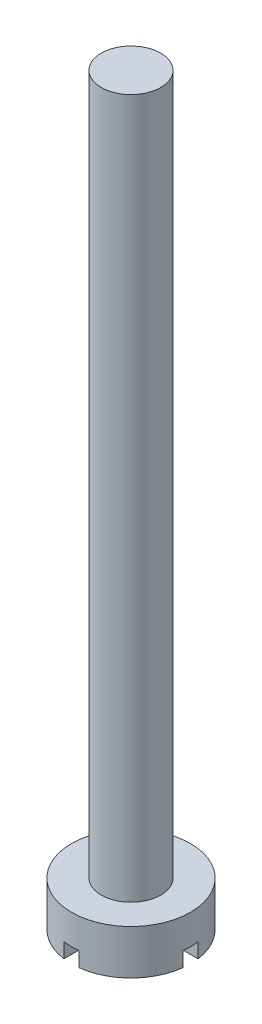
ISO-10303-21;
HEADER;
FILE_DESCRIPTION(('STEP AP214'),'2;1');
FILE_NAME('part.step','',(''),(''),'','','');
FILE_SCHEMA(('AUTOMOTIVE_DESIGN { 1 0 10303 214 1 1 1 1 }'));
ENDSEC;
DATA;
#1=APPLICATION_CONTEXT('core data for automotive mechanical design processes');
#2=APPLICATION_PROTOCOL_DEFINITION('international standard','automotive_design',2000,#1);
#3=PRODUCT_CONTEXT('',#1,'mechanical');
#4=PRODUCT('Part','Part','',(#3));
#5=PRODUCT_RELATED_PRODUCT_CATEGORY('part','',(#4));
#6=PRODUCT_DEFINITION_FORMATION('','',#4);
#7=PRODUCT_DEFINITION_CONTEXT('part definition',#1,'design');
#8=PRODUCT_DEFINITION('design','',#6,#7);
#9=PRODUCT_DEFINITION_SHAPE('','',#8);
#10=(LENGTH_UNIT() NAMED_UNIT(*) SI_UNIT(.MILLI.,.METRE.));
#11=(NAMED_UNIT(*) PLANE_ANGLE_UNIT() SI_UNIT($,.RADIAN.));
#12=(NAMED_UNIT(*) SI_UNIT($,.STERADIAN.) SOLID_ANGLE_UNIT());
#13=UNCERTAINTY_MEASURE_WITH_UNIT(LENGTH_MEASURE(1.E-05),#10,'distance_accuracy_value','');
#14=(GEOMETRIC_REPRESENTATION_CONTEXT(3) GLOBAL_UNCERTAINTY_ASSIGNED_CONTEXT((#13)) GLOBAL_UNIT_ASSIGNED_CONTEXT((#10,
#11,#12)) REPRESENTATION_CONTEXT('',''));
#15=CARTESIAN_POINT('',(0.,0.,0.));
#16=DIRECTION('',(0.,0.,1.));
#17=DIRECTION('',(1.,0.,0.));
#18=AXIS2_PLACEMENT_3D('',#15,#16,#17);
#19=CARTESIAN_POINT('',(0.,0.,0.));
#20=DIRECTION('',(0.,1.,0.));
#21=DIRECTION('',(0.,0.,1.));
#22=AXIS2_PLACEMENT_3D('',#19,#20,#21);
#23=PLANE('',#22);
#24=DIRECTION('',(0.,0.,1.));
#25=VECTOR('',#24,1.);
#26=CARTESIAN_POINT('',(-0.548123781601143,0.,0.));
#27=LINE('',#26,#25);
#28=CARTESIAN_POINT('',(-0.548123781601143,0.,-3.96226706823799));
#29=VERTEX_POINT('',#28);
#30=CARTESIAN_POINT('',(-0.548123781601143,0.,-0.542853360624412));
#31=VERTEX_POINT('',#30);
#32=EDGE_CURVE('E169',#29,#31,#27,.T.);
#33=ORIENTED_EDGE('',*,*,#32,.T.);
#34=DIRECTION('',(-1.,0.,0.));
#35=VECTOR('',#34,1.);
#36=CARTESIAN_POINT('',(0.,0.,-0.542853360624412));
#37=LINE('',#36,#35);
#38=CARTESIAN_POINT('',(-3.96299258501183,0.,-0.542853360624412));
#39=VERTEX_POINT('',#38);
#40=EDGE_CURVE('E204',#31,#39,#37,.T.);
#41=ORIENTED_EDGE('',*,*,#40,.T.);
#42=CARTESIAN_POINT('',(0.,0.,0.));
#43=DIRECTION('',(0.,1.,0.));
#44=DIRECTION('',(0.,0.,1.));
#45=AXIS2_PLACEMENT_3D('',#42,#43,#44);
#46=CIRCLE('',#45,4.);
#47=EDGE_CURVE('E262',#29,#39,#46,.T.);
#48=ORIENTED_EDGE('',*,*,#47,.F.);
#49=EDGE_LOOP('',(#33,#41,#48));
#50=FACE_BOUND('',#49,.T.);
#51=ADVANCED_FACE('F72',(#50),#23,.F.);
#52=DIRECTION('',(-1.,0.,0.));
#53=VECTOR('',#52,1.);
#54=CARTESIAN_POINT('',(0.,0.,-0.542853360624412));
#55=LINE('',#54,#53);
#56=CARTESIAN_POINT('',(3.96299258501183,0.,-0.542853360624412));
#57=VERTEX_POINT('',#56);
#58=CARTESIAN_POINT('',(0.463797045970191,0.,-0.542853360624412));
#59=VERTEX_POINT('',#58);
#60=EDGE_CURVE('E197',#57,#59,#55,.T.);
#61=ORIENTED_EDGE('',*,*,#60,.T.);
#62=DIRECTION('',(0.,0.,1.));
#63=VECTOR('',#62,1.);
#64=CARTESIAN_POINT('',(0.463797045970191,0.,0.));
#65=LINE('',#64,#63);
#66=CARTESIAN_POINT('',(0.463797045970191,0.,-3.97302055118638));
#67=VERTEX_POINT('',#66);
#68=EDGE_CURVE('E174',#67,#59,#65,.T.);
#69=ORIENTED_EDGE('',*,*,#68,.F.);
#70=EDGE_CURVE('E246',#57,#67,#46,.T.);
#71=ORIENTED_EDGE('',*,*,#70,.F.);
#72=EDGE_LOOP('',(#61,#69,#71));
#73=FACE_BOUND('',#72,.T.);
#74=ADVANCED_FACE('F285',(#73),#23,.F.);
#75=CARTESIAN_POINT('',(-3.97240175604783,0.,0.46906746694701));
#76=VERTEX_POINT('',#75);
#77=CARTESIAN_POINT('',(-0.548123781601143,0.,3.96226706823799));
#78=VERTEX_POINT('',#77);
#79=EDGE_CURVE('E238',#76,#78,#46,.T.);
#80=ORIENTED_EDGE('',*,*,#79,.F.);
#81=DIRECTION('',(-1.,0.,0.));
#82=VECTOR('',#81,1.);
#83=CARTESIAN_POINT('',(0.,0.,0.46906746694701));
#84=LINE('',#83,#82);
#85=CARTESIAN_POINT('',(-0.548123781601143,0.,0.46906746694701));
#86=VERTEX_POINT('',#85);
#87=EDGE_CURVE('E200',#86,#76,#84,.T.);
#88=ORIENTED_EDGE('',*,*,#87,.F.);
#89=DIRECTION('',(0.,0.,1.));
#90=VECTOR('',#89,1.);
#91=CARTESIAN_POINT('',(-0.548123781601143,0.,-4.18998467666297));
#92=LINE('',#91,#90);
#93=EDGE_CURVE('E225',#86,#78,#92,.T.);
#94=ORIENTED_EDGE('',*,*,#93,.T.);
#95=EDGE_LOOP('',(#80,#88,#94));
#96=FACE_BOUND('',#95,.T.);
#97=ADVANCED_FACE('F272',(#96),#23,.F.);
#98=CARTESIAN_POINT('',(0.,3.,0.));
#99=DIRECTION('',(0.,-1.,0.));
#100=DIRECTION('',(0.,0.,-1.));
#101=AXIS2_PLACEMENT_3D('',#98,#99,#100);
#102=CYLINDRICAL_SURFACE('',#101,4.);
#103=CARTESIAN_POINT('',(0.,3.,0.));
#104=DIRECTION('',(0.,1.,0.));
#105=DIRECTION('',(0.,0.,1.));
#106=AXIS2_PLACEMENT_3D('',#103,#104,#105);
#107=CIRCLE('',#106,4.);
#108=CARTESIAN_POINT('',(0.,3.,4.));
#109=VERTEX_POINT('',#108);
#110=EDGE_CURVE('E239',#109,#109,#107,.T.);
#111=ORIENTED_EDGE('',*,*,#110,.F.);
#112=EDGE_LOOP('',(#111));
#113=FACE_BOUND('',#112,.T.);
#114=CARTESIAN_POINT('',(0.463797045970191,0.,3.97302055118638));
#115=VERTEX_POINT('',#114);
#116=CARTESIAN_POINT('',(3.97240175604783,0.,0.46906746694701));
#117=VERTEX_POINT('',#116);
#118=EDGE_CURVE('E243',#115,#117,#46,.T.);
#119=ORIENTED_EDGE('',*,*,#118,.T.);
#120=DIRECTION('',(0.,-1.,0.));
#121=VECTOR('',#120,1.);
#122=CARTESIAN_POINT('',(3.97240175604783,1.,0.46906746694701));
#123=LINE('',#122,#121);
#124=CARTESIAN_POINT('',(3.97240175604783,1.,0.46906746694701));
#125=VERTEX_POINT('',#124);
#126=EDGE_CURVE('E217',#125,#117,#123,.T.);
#127=ORIENTED_EDGE('',*,*,#126,.F.);
#128=CARTESIAN_POINT('',(0.,1.,0.));
#129=DIRECTION('',(0.,-1.,0.));
#130=DIRECTION('',(0.,0.,-1.));
#131=AXIS2_PLACEMENT_3D('',#128,#129,#130);
#132=CIRCLE('',#131,4.);
#133=CARTESIAN_POINT('',(3.96299258501183,1.,-0.542853360624412));
#134=VERTEX_POINT('',#133);
#135=EDGE_CURVE('E182',#134,#125,#132,.T.);
#136=ORIENTED_EDGE('',*,*,#135,.F.);
#137=DIRECTION('',(0.,-1.,0.));
#138=VECTOR('',#137,1.);
#139=CARTESIAN_POINT('',(3.96299258501183,1.,-0.542853360624412));
#140=LINE('',#139,#138);
#141=EDGE_CURVE('E177',#134,#57,#140,.T.);
#142=ORIENTED_EDGE('',*,*,#141,.T.);
#143=ORIENTED_EDGE('',*,*,#70,.T.);
#144=DIRECTION('',(0.,-1.,0.));
#145=VECTOR('',#144,1.);
#146=CARTESIAN_POINT('',(0.463797045970191,3.,-3.97302055118638));
#147=LINE('',#146,#145);
#148=CARTESIAN_POINT('',(0.463797045970191,1.,-3.97302055118638));
#149=VERTEX_POINT('',#148);
#150=EDGE_CURVE('E12',#67,#149,#147,.F.);
#151=ORIENTED_EDGE('',*,*,#150,.T.);
#152=CARTESIAN_POINT('',(0.,1.,0.));
#153=DIRECTION('',(0.,-1.,0.));
#154=DIRECTION('',(0.,0.,-1.));
#155=AXIS2_PLACEMENT_3D('',#152,#153,#154);
#156=CIRCLE('',#155,4.);
#157=CARTESIAN_POINT('',(-0.548123781601143,1.,-3.96226706823799));
#158=VERTEX_POINT('',#157);
#159=EDGE_CURVE('E168',#158,#149,#156,.T.);
#160=ORIENTED_EDGE('',*,*,#159,.F.);
#161=DIRECTION('',(0.,-1.,0.));
#162=VECTOR('',#161,1.);
#163=CARTESIAN_POINT('',(-0.548123781601143,3.,-3.96226706823799));
#164=LINE('',#163,#162);
#165=EDGE_CURVE('E80',#29,#158,#164,.F.);
#166=ORIENTED_EDGE('',*,*,#165,.F.);
#167=ORIENTED_EDGE('',*,*,#47,.T.);
#168=DIRECTION('',(0.,-1.,0.));
#169=VECTOR('',#168,1.);
#170=CARTESIAN_POINT('',(-3.96299258501183,1.,-0.542853360624412));
#171=LINE('',#170,#169);
#172=CARTESIAN_POINT('',(-3.96299258501183,1.,-0.542853360624412));
#173=VERTEX_POINT('',#172);
#174=EDGE_CURVE('E212',#173,#39,#171,.T.);
#175=ORIENTED_EDGE('',*,*,#174,.F.);
#176=CARTESIAN_POINT('',(0.,1.,0.));
#177=DIRECTION('',(0.,-1.,0.));
#178=DIRECTION('',(0.,0.,-1.));
#179=AXIS2_PLACEMENT_3D('',#176,#177,#178);
#180=CIRCLE('',#179,4.);
#181=CARTESIAN_POINT('',(-3.97240175604783,1.,0.46906746694701));
#182=VERTEX_POINT('',#181);
#183=EDGE_CURVE('E190',#182,#173,#180,.T.);
#184=ORIENTED_EDGE('',*,*,#183,.F.);
#185=DIRECTION('',(0.,-1.,0.));
#186=VECTOR('',#185,1.);
#187=CARTESIAN_POINT('',(-3.97240175604783,1.,0.46906746694701));
#188=LINE('',#187,#186);
#189=EDGE_CURVE('E214',#182,#76,#188,.T.);
#190=ORIENTED_EDGE('',*,*,#189,.T.);
#191=ORIENTED_EDGE('',*,*,#79,.T.);
#192=DIRECTION('',(0.,-1.,0.));
#193=VECTOR('',#192,1.);
#194=CARTESIAN_POINT('',(-0.548123781601143,3.,3.96226706823799));
#195=LINE('',#194,#193);
#196=CARTESIAN_POINT('',(-0.548123781601143,1.,3.96226706823799));
#197=VERTEX_POINT('',#196);
#198=EDGE_CURVE('E250',#197,#78,#195,.T.);
#199=ORIENTED_EDGE('',*,*,#198,.F.);
#200=CARTESIAN_POINT('',(0.463797045970191,1.,3.97302055118638));
#201=VERTEX_POINT('',#200);
#202=EDGE_CURVE('E248',#201,#197,#156,.T.);
#203=ORIENTED_EDGE('',*,*,#202,.F.);
#204=DIRECTION('',(0.,-1.,0.));
#205=VECTOR('',#204,1.);
#206=CARTESIAN_POINT('',(0.463797045970191,3.,3.97302055118638));
#207=LINE('',#206,#205);
#208=EDGE_CURVE('E242',#201,#115,#207,.T.);
#209=ORIENTED_EDGE('',*,*,#208,.T.);
#210=EDGE_LOOP('',(#119,#127,#136,#142,#143,#151,#160,#166,#167,#175,#184,#190,#191,#199,#203,#209));
#211=FACE_BOUND('',#210,.T.);
#212=ADVANCED_FACE('F74',(#113,#211),#102,.T.);
#213=CARTESIAN_POINT('',(0.,3.,0.));
#214=DIRECTION('',(0.,1.,0.));
#215=DIRECTION('',(0.,0.,1.));
#216=AXIS2_PLACEMENT_3D('',#213,#214,#215);
#217=PLANE('',#216);
#218=ORIENTED_EDGE('',*,*,#110,.T.);
#219=EDGE_LOOP('',(#218));
#220=FACE_BOUND('',#219,.T.);
#221=CARTESIAN_POINT('',(0.,3.,0.));
#222=DIRECTION('',(0.,1.,0.));
#223=DIRECTION('',(0.,0.,1.));
#224=AXIS2_PLACEMENT_3D('',#221,#222,#223);
#225=CIRCLE('',#224,2.);
#226=CARTESIAN_POINT('',(0.,3.,2.));
#227=VERTEX_POINT('',#226);
#228=EDGE_CURVE('E235',#227,#227,#225,.T.);
#229=ORIENTED_EDGE('',*,*,#228,.F.);
#230=EDGE_LOOP('',(#229));
#231=FACE_BOUND('',#230,.T.);
#232=ADVANCED_FACE('F293',(#220,#231),#217,.T.);
#233=DIRECTION('',(0.,0.,1.));
#234=VECTOR('',#233,1.);
#235=CARTESIAN_POINT('',(0.463797045970191,0.,-4.18998467666297));
#236=LINE('',#235,#234);
#237=CARTESIAN_POINT('',(0.463797045970191,0.,0.46906746694701));
#238=VERTEX_POINT('',#237);
#239=EDGE_CURVE('E87',#238,#115,#236,.T.);
#240=ORIENTED_EDGE('',*,*,#239,.F.);
#241=EDGE_CURVE('E201',#117,#238,#84,.T.);
#242=ORIENTED_EDGE('',*,*,#241,.F.);
#243=ORIENTED_EDGE('',*,*,#118,.F.);
#244=EDGE_LOOP('',(#240,#242,#243));
#245=FACE_BOUND('',#244,.T.);
#246=ADVANCED_FACE('F286',(#245),#23,.F.);
#247=CARTESIAN_POINT('',(0.,50.,0.));
#248=DIRECTION('',(0.,-1.,0.));
#249=DIRECTION('',(0.,0.,-1.));
#250=AXIS2_PLACEMENT_3D('',#247,#248,#249);
#251=CYLINDRICAL_SURFACE('',#250,2.);
#252=ORIENTED_EDGE('',*,*,#228,.T.);
#253=EDGE_LOOP('',(#252));
#254=FACE_BOUND('',#253,.T.);
#255=CARTESIAN_POINT('',(0.,50.,0.));
#256=DIRECTION('',(0.,1.,0.));
#257=DIRECTION('',(0.,0.,1.));
#258=AXIS2_PLACEMENT_3D('',#255,#256,#257);
#259=CIRCLE('',#258,2.);
#260=CARTESIAN_POINT('',(0.,50.,2.));
#261=VERTEX_POINT('',#260);
#262=EDGE_CURVE('E232',#261,#261,#259,.T.);
#263=ORIENTED_EDGE('',*,*,#262,.F.);
#264=EDGE_LOOP('',(#263));
#265=FACE_BOUND('',#264,.T.);
#266=ADVANCED_FACE('F292',(#254,#265),#251,.T.);
#267=CARTESIAN_POINT('',(0.,50.,0.));
#268=DIRECTION('',(0.,1.,0.));
#269=DIRECTION('',(0.,0.,1.));
#270=AXIS2_PLACEMENT_3D('',#267,#268,#269);
#271=PLANE('',#270);
#272=ORIENTED_EDGE('',*,*,#262,.T.);
#273=EDGE_LOOP('',(#272));
#274=FACE_BOUND('',#273,.T.);
#275=ADVANCED_FACE('F299',(#274),#271,.T.);
#276=CARTESIAN_POINT('',(0.463797045970191,1.,0.));
#277=DIRECTION('',(1.,0.,0.));
#278=DIRECTION('',(0.,0.,-1.));
#279=AXIS2_PLACEMENT_3D('',#276,#277,#278);
#280=PLANE('',#279);
#281=ORIENTED_EDGE('',*,*,#68,.T.);
#282=DIRECTION('',(0.,-1.,0.));
#283=VECTOR('',#282,1.);
#284=CARTESIAN_POINT('',(0.463797045970191,1.,-0.542853360624412));
#285=LINE('',#284,#283);
#286=CARTESIAN_POINT('',(0.463797045970191,1.,-0.542853360624412));
#287=VERTEX_POINT('',#286);
#288=EDGE_CURVE('E172',#287,#59,#285,.T.);
#289=ORIENTED_EDGE('',*,*,#288,.F.);
#290=DIRECTION('',(0.,0.,1.));
#291=VECTOR('',#290,1.);
#292=CARTESIAN_POINT('',(0.463797045970191,1.,0.));
#293=LINE('',#292,#291);
#294=EDGE_CURVE('E159',#149,#287,#293,.T.);
#295=ORIENTED_EDGE('',*,*,#294,.F.);
#296=ORIENTED_EDGE('',*,*,#150,.F.);
#297=EDGE_LOOP('',(#281,#289,#295,#296));
#298=FACE_BOUND('',#297,.T.);
#299=ADVANCED_FACE('F173',(#298),#280,.F.);
#300=CARTESIAN_POINT('',(-0.548123781601143,1.,0.));
#301=DIRECTION('',(1.,0.,0.));
#302=DIRECTION('',(0.,0.,-1.));
#303=AXIS2_PLACEMENT_3D('',#300,#301,#302);
#304=PLANE('',#303);
#305=ORIENTED_EDGE('',*,*,#165,.T.);
#306=DIRECTION('',(0.,0.,1.));
#307=VECTOR('',#306,1.);
#308=CARTESIAN_POINT('',(-0.548123781601143,1.,0.));
#309=LINE('',#308,#307);
#310=CARTESIAN_POINT('',(-0.548123781601143,1.,-0.542853360624412));
#311=VERTEX_POINT('',#310);
#312=EDGE_CURVE('E178',#158,#311,#309,.T.);
#313=ORIENTED_EDGE('',*,*,#312,.T.);
#314=DIRECTION('',(0.,-1.,0.));
#315=VECTOR('',#314,1.);
#316=CARTESIAN_POINT('',(-0.548123781601143,1.,-0.542853360624412));
#317=LINE('',#316,#315);
#318=EDGE_CURVE('E209',#311,#31,#317,.T.);
#319=ORIENTED_EDGE('',*,*,#318,.T.);
#320=ORIENTED_EDGE('',*,*,#32,.F.);
#321=EDGE_LOOP('',(#305,#313,#319,#320));
#322=FACE_BOUND('',#321,.T.);
#323=ADVANCED_FACE('F253',(#322),#304,.T.);
#324=CARTESIAN_POINT('',(0.,1.,0.));
#325=DIRECTION('',(0.,-1.,0.));
#326=DIRECTION('',(0.,0.,-1.));
#327=AXIS2_PLACEMENT_3D('',#324,#325,#326);
#328=PLANE('',#327);
#329=ORIENTED_EDGE('',*,*,#202,.T.);
#330=DIRECTION('',(0.,0.,1.));
#331=VECTOR('',#330,1.);
#332=CARTESIAN_POINT('',(-0.548123781601143,1.,-4.18998467666297));
#333=LINE('',#332,#331);
#334=CARTESIAN_POINT('',(-0.548123781601143,1.,0.46906746694701));
#335=VERTEX_POINT('',#334);
#336=EDGE_CURVE('E220',#335,#197,#333,.T.);
#337=ORIENTED_EDGE('',*,*,#336,.F.);
#338=DIRECTION('',(-1.,0.,0.));
#339=VECTOR('',#338,1.);
#340=CARTESIAN_POINT('',(0.,1.,0.46906746694701));
#341=LINE('',#340,#339);
#342=EDGE_CURVE('E184',#335,#182,#341,.T.);
#343=ORIENTED_EDGE('',*,*,#342,.T.);
#344=ORIENTED_EDGE('',*,*,#183,.T.);
#345=DIRECTION('',(-1.,0.,0.));
#346=VECTOR('',#345,1.);
#347=CARTESIAN_POINT('',(0.,1.,-0.542853360624412));
#348=LINE('',#347,#346);
#349=EDGE_CURVE('E193',#311,#173,#348,.T.);
#350=ORIENTED_EDGE('',*,*,#349,.F.);
#351=ORIENTED_EDGE('',*,*,#312,.F.);
#352=ORIENTED_EDGE('',*,*,#159,.T.);
#353=ORIENTED_EDGE('',*,*,#294,.T.);
#354=DIRECTION('',(-1.,0.,0.));
#355=VECTOR('',#354,1.);
#356=CARTESIAN_POINT('',(0.,1.,-0.542853360624412));
#357=LINE('',#356,#355);
#358=EDGE_CURVE('E164',#134,#287,#357,.T.);
#359=ORIENTED_EDGE('',*,*,#358,.F.);
#360=ORIENTED_EDGE('',*,*,#135,.T.);
#361=CARTESIAN_POINT('',(0.463797045970191,1.,0.46906746694701));
#362=VERTEX_POINT('',#361);
#363=EDGE_CURVE('E187',#125,#362,#341,.T.);
#364=ORIENTED_EDGE('',*,*,#363,.T.);
#365=DIRECTION('',(0.,0.,1.));
#366=VECTOR('',#365,1.);
#367=CARTESIAN_POINT('',(0.463797045970191,1.,-4.18998467666297));
#368=LINE('',#367,#366);
#369=EDGE_CURVE('E198',#362,#201,#368,.T.);
#370=ORIENTED_EDGE('',*,*,#369,.T.);
#371=EDGE_LOOP('',(#329,#337,#343,#344,#350,#351,#352,#353,#359,#360,#364,#370));
#372=FACE_BOUND('',#371,.T.);
#373=ADVANCED_FACE('F161',(#372),#328,.T.);
#374=CARTESIAN_POINT('',(-0.548123781601143,1.,-4.18998467666297));
#375=DIRECTION('',(1.,0.,0.));
#376=DIRECTION('',(0.,0.,-1.));
#377=AXIS2_PLACEMENT_3D('',#374,#375,#376);
#378=PLANE('',#377);
#379=ORIENTED_EDGE('',*,*,#198,.T.);
#380=ORIENTED_EDGE('',*,*,#93,.F.);
#381=DIRECTION('',(0.,1.,0.));
#382=VECTOR('',#381,1.);
#383=CARTESIAN_POINT('',(-0.548123781601143,1.,0.46906746694701));
#384=LINE('',#383,#382);
#385=EDGE_CURVE('E230',#86,#335,#384,.T.);
#386=ORIENTED_EDGE('',*,*,#385,.T.);
#387=ORIENTED_EDGE('',*,*,#336,.T.);
#388=EDGE_LOOP('',(#379,#380,#386,#387));
#389=FACE_BOUND('',#388,.T.);
#390=ADVANCED_FACE('F275',(#389),#378,.T.);
#391=CARTESIAN_POINT('',(0.463797045970191,1.,-4.18998467666297));
#392=DIRECTION('',(1.,0.,0.));
#393=DIRECTION('',(0.,0.,-1.));
#394=AXIS2_PLACEMENT_3D('',#391,#392,#393);
#395=PLANE('',#394);
#396=ORIENTED_EDGE('',*,*,#369,.F.);
#397=DIRECTION('',(0.,1.,0.));
#398=VECTOR('',#397,1.);
#399=CARTESIAN_POINT('',(0.463797045970191,1.,0.46906746694701));
#400=LINE('',#399,#398);
#401=EDGE_CURVE('E211',#238,#362,#400,.T.);
#402=ORIENTED_EDGE('',*,*,#401,.F.);
#403=ORIENTED_EDGE('',*,*,#239,.T.);
#404=ORIENTED_EDGE('',*,*,#208,.F.);
#405=EDGE_LOOP('',(#396,#402,#403,#404));
#406=FACE_BOUND('',#405,.T.);
#407=ADVANCED_FACE('F325',(#406),#395,.F.);
#408=CARTESIAN_POINT('',(0.,1.,0.46906746694701));
#409=DIRECTION('',(0.,0.,1.));
#410=DIRECTION('',(1.,0.,0.));
#411=AXIS2_PLACEMENT_3D('',#408,#409,#410);
#412=PLANE('',#411);
#413=ORIENTED_EDGE('',*,*,#401,.T.);
#414=ORIENTED_EDGE('',*,*,#363,.F.);
#415=ORIENTED_EDGE('',*,*,#126,.T.);
#416=ORIENTED_EDGE('',*,*,#241,.T.);
#417=EDGE_LOOP('',(#413,#414,#415,#416));
#418=FACE_BOUND('',#417,.T.);
#419=ADVANCED_FACE('F327',(#418),#412,.F.);
#420=CARTESIAN_POINT('',(0.,1.,-0.542853360624412));
#421=DIRECTION('',(0.,0.,1.));
#422=DIRECTION('',(1.,0.,0.));
#423=AXIS2_PLACEMENT_3D('',#420,#421,#422);
#424=PLANE('',#423);
#425=ORIENTED_EDGE('',*,*,#60,.F.);
#426=ORIENTED_EDGE('',*,*,#141,.F.);
#427=ORIENTED_EDGE('',*,*,#358,.T.);
#428=ORIENTED_EDGE('',*,*,#288,.T.);
#429=EDGE_LOOP('',(#425,#426,#427,#428));
#430=FACE_BOUND('',#429,.T.);
#431=ADVANCED_FACE('F180',(#430),#424,.T.);
#432=ORIENTED_EDGE('',*,*,#87,.T.);
#433=ORIENTED_EDGE('',*,*,#189,.F.);
#434=ORIENTED_EDGE('',*,*,#342,.F.);
#435=ORIENTED_EDGE('',*,*,#385,.F.);
#436=EDGE_LOOP('',(#432,#433,#434,#435));
#437=FACE_BOUND('',#436,.T.);
#438=ADVANCED_FACE('F279',(#437),#412,.F.);
#439=CARTESIAN_POINT('',(0.,1.,-0.542853360624412));
#440=DIRECTION('',(0.,0.,1.));
#441=DIRECTION('',(1.,0.,0.));
#442=AXIS2_PLACEMENT_3D('',#439,#440,#441);
#443=PLANE('',#442);
#444=ORIENTED_EDGE('',*,*,#40,.F.);
#445=ORIENTED_EDGE('',*,*,#318,.F.);
#446=ORIENTED_EDGE('',*,*,#349,.T.);
#447=ORIENTED_EDGE('',*,*,#174,.T.);
#448=EDGE_LOOP('',(#444,#445,#446,#447));
#449=FACE_BOUND('',#448,.T.);
#450=ADVANCED_FACE('F282',(#449),#443,.T.);
#451=CLOSED_SHELL('',(#51,#74,#97,#212,#232,#246,#266,#275,#299,#323,#373,#390,#407,#419,#431,
#438,#450));
#452=MANIFOLD_SOLID_BREP('B2',#451);
#453=ADVANCED_BREP_SHAPE_REPRESENTATION('',(#18,#452),#14);
#454=SHAPE_DEFINITION_REPRESENTATION(#9,#453);
ENDSEC;
END-ISO-10303-21;
